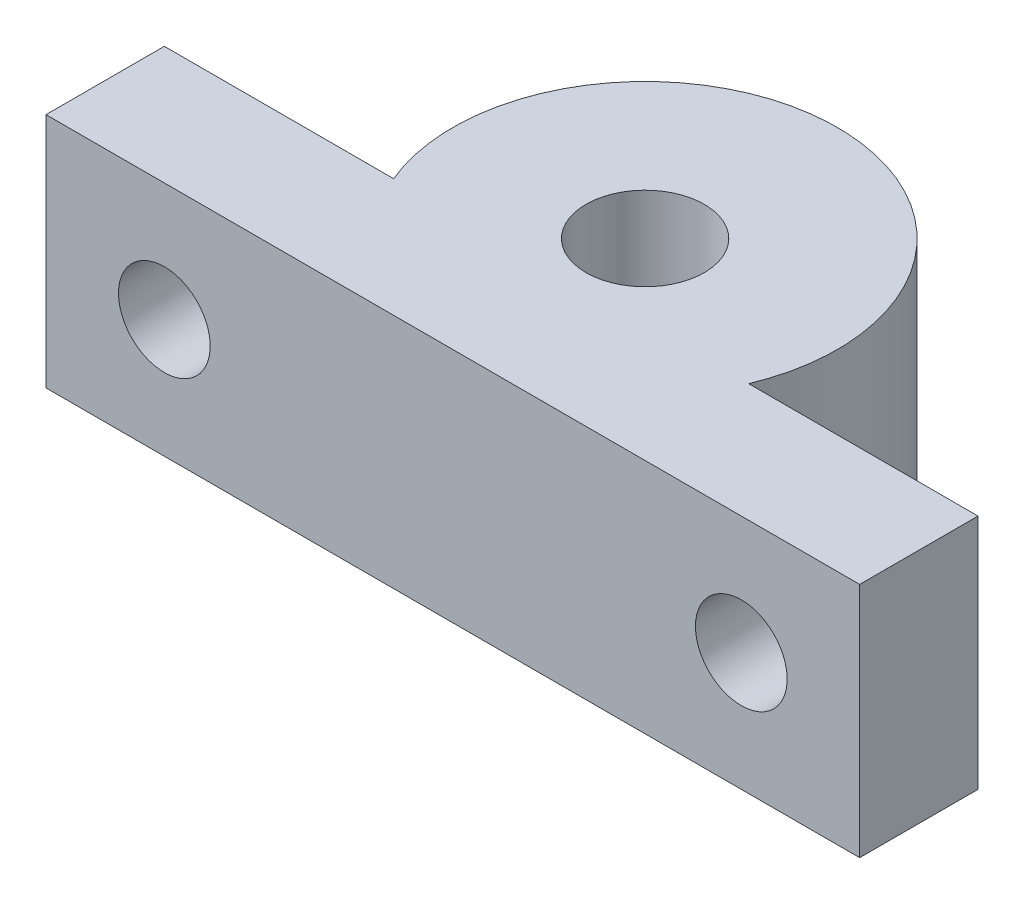
ISO-10303-21;
HEADER;
FILE_DESCRIPTION(('STEP AP214'),'2;1');
FILE_NAME('part.step','',(''),(''),'','','');
FILE_SCHEMA(('AUTOMOTIVE_DESIGN { 1 0 10303 214 1 1 1 1 }'));
ENDSEC;
DATA;
#1=APPLICATION_CONTEXT('core data for automotive mechanical design processes');
#2=APPLICATION_PROTOCOL_DEFINITION('international standard','automotive_design',2000,#1);
#3=PRODUCT_CONTEXT('',#1,'mechanical');
#4=PRODUCT('Part','Part','',(#3));
#5=PRODUCT_RELATED_PRODUCT_CATEGORY('part','',(#4));
#6=PRODUCT_DEFINITION_FORMATION('','',#4);
#7=PRODUCT_DEFINITION_CONTEXT('part definition',#1,'design');
#8=PRODUCT_DEFINITION('design','',#6,#7);
#9=PRODUCT_DEFINITION_SHAPE('','',#8);
#10=(LENGTH_UNIT() NAMED_UNIT(*) SI_UNIT(.MILLI.,.METRE.));
#11=(NAMED_UNIT(*) PLANE_ANGLE_UNIT() SI_UNIT($,.RADIAN.));
#12=(NAMED_UNIT(*) SI_UNIT($,.STERADIAN.) SOLID_ANGLE_UNIT());
#13=UNCERTAINTY_MEASURE_WITH_UNIT(LENGTH_MEASURE(1.E-05),#10,'distance_accuracy_value','');
#14=(GEOMETRIC_REPRESENTATION_CONTEXT(3) GLOBAL_UNCERTAINTY_ASSIGNED_CONTEXT((#13)) GLOBAL_UNIT_ASSIGNED_CONTEXT((#10,
#11,#12)) REPRESENTATION_CONTEXT('',''));
#15=CARTESIAN_POINT('',(0.,0.,0.));
#16=DIRECTION('',(0.,0.,1.));
#17=DIRECTION('',(1.,0.,0.));
#18=AXIS2_PLACEMENT_3D('',#15,#16,#17);
#19=CARTESIAN_POINT('',(0.,8.,0.));
#20=DIRECTION('',(0.,-1.,0.));
#21=DIRECTION('',(0.,0.,-1.));
#22=AXIS2_PLACEMENT_3D('',#19,#20,#21);
#23=CYLINDRICAL_SURFACE('',#22,6.5);
#24=CARTESIAN_POINT('',(0.,8.,0.));
#25=DIRECTION('',(0.,1.,0.));
#26=DIRECTION('',(0.,0.,1.));
#27=AXIS2_PLACEMENT_3D('',#24,#25,#26);
#28=CIRCLE('',#27,6.5);
#29=CARTESIAN_POINT('',(6.,8.,2.5));
#30=VERTEX_POINT('',#29);
#31=CARTESIAN_POINT('',(-6.,8.,2.5));
#32=VERTEX_POINT('',#31);
#33=EDGE_CURVE('E11',#30,#32,#28,.T.);
#34=ORIENTED_EDGE('',*,*,#33,.F.);
#35=DIRECTION('',(0.,-1.,0.));
#36=VECTOR('',#35,1.);
#37=CARTESIAN_POINT('',(6.,8.,2.5));
#38=LINE('',#37,#36);
#39=CARTESIAN_POINT('',(6.,0.,2.5));
#40=VERTEX_POINT('',#39);
#41=EDGE_CURVE('E156',#30,#40,#38,.T.);
#42=ORIENTED_EDGE('',*,*,#41,.T.);
#43=CARTESIAN_POINT('',(0.,0.,0.));
#44=DIRECTION('',(0.,1.,0.));
#45=DIRECTION('',(0.,0.,1.));
#46=AXIS2_PLACEMENT_3D('',#43,#44,#45);
#47=CIRCLE('',#46,6.5);
#48=CARTESIAN_POINT('',(-6.,0.,2.5));
#49=VERTEX_POINT('',#48);
#50=EDGE_CURVE('E46',#40,#49,#47,.T.);
#51=ORIENTED_EDGE('',*,*,#50,.T.);
#52=DIRECTION('',(0.,-1.,0.));
#53=VECTOR('',#52,1.);
#54=CARTESIAN_POINT('',(-6.,8.,2.5));
#55=LINE('',#54,#53);
#56=EDGE_CURVE('E114',#49,#32,#55,.F.);
#57=ORIENTED_EDGE('',*,*,#56,.T.);
#58=EDGE_LOOP('',(#34,#42,#51,#57));
#59=FACE_BOUND('',#58,.T.);
#60=ADVANCED_FACE('F43',(#59),#23,.T.);
#61=CARTESIAN_POINT('',(0.,8.,0.));
#62=DIRECTION('',(0.,1.,0.));
#63=DIRECTION('',(0.,0.,1.));
#64=AXIS2_PLACEMENT_3D('',#61,#62,#63);
#65=PLANE('',#64);
#66=CARTESIAN_POINT('',(0.,8.,0.));
#67=DIRECTION('',(0.,1.,0.));
#68=DIRECTION('',(0.,0.,1.));
#69=AXIS2_PLACEMENT_3D('',#66,#67,#68);
#70=CIRCLE('',#69,2.);
#71=CARTESIAN_POINT('',(0.,8.,2.));
#72=VERTEX_POINT('',#71);
#73=EDGE_CURVE('E231',#72,#72,#70,.T.);
#74=ORIENTED_EDGE('',*,*,#73,.F.);
#75=EDGE_LOOP('',(#74));
#76=FACE_BOUND('',#75,.T.);
#77=ORIENTED_EDGE('',*,*,#33,.T.);
#78=DIRECTION('',(-1.,0.,0.));
#79=VECTOR('',#78,1.);
#80=CARTESIAN_POINT('',(-13.75,8.,2.5));
#81=LINE('',#80,#79);
#82=CARTESIAN_POINT('',(-13.75,8.,2.5));
#83=VERTEX_POINT('',#82);
#84=EDGE_CURVE('E58',#32,#83,#81,.T.);
#85=ORIENTED_EDGE('',*,*,#84,.T.);
#86=DIRECTION('',(0.,0.,1.));
#87=VECTOR('',#86,1.);
#88=CARTESIAN_POINT('',(-13.75,8.,2.5));
#89=LINE('',#88,#87);
#90=CARTESIAN_POINT('',(-13.75,8.,6.5));
#91=VERTEX_POINT('',#90);
#92=EDGE_CURVE('E121',#83,#91,#89,.T.);
#93=ORIENTED_EDGE('',*,*,#92,.T.);
#94=DIRECTION('',(-1.,0.,0.));
#95=VECTOR('',#94,1.);
#96=CARTESIAN_POINT('',(-13.75,8.,6.5));
#97=LINE('',#96,#95);
#98=CARTESIAN_POINT('',(13.75,8.,6.5));
#99=VERTEX_POINT('',#98);
#100=EDGE_CURVE('E123',#99,#91,#97,.T.);
#101=ORIENTED_EDGE('',*,*,#100,.F.);
#102=DIRECTION('',(0.,0.,1.));
#103=VECTOR('',#102,1.);
#104=CARTESIAN_POINT('',(13.75,8.,2.5));
#105=LINE('',#104,#103);
#106=CARTESIAN_POINT('',(13.75,8.,2.5));
#107=VERTEX_POINT('',#106);
#108=EDGE_CURVE('E149',#107,#99,#105,.T.);
#109=ORIENTED_EDGE('',*,*,#108,.F.);
#110=EDGE_CURVE('E110',#107,#30,#81,.T.);
#111=ORIENTED_EDGE('',*,*,#110,.T.);
#112=EDGE_LOOP('',(#77,#85,#93,#101,#109,#111));
#113=FACE_BOUND('',#112,.T.);
#114=ADVANCED_FACE('F168',(#76,#113),#65,.T.);
#115=CARTESIAN_POINT('',(0.,0.,0.));
#116=DIRECTION('',(0.,1.,0.));
#117=DIRECTION('',(0.,0.,1.));
#118=AXIS2_PLACEMENT_3D('',#115,#116,#117);
#119=PLANE('',#118);
#120=CARTESIAN_POINT('',(0.,0.,0.));
#121=DIRECTION('',(0.,1.,0.));
#122=DIRECTION('',(0.,0.,1.));
#123=AXIS2_PLACEMENT_3D('',#120,#121,#122);
#124=CIRCLE('',#123,2.);
#125=CARTESIAN_POINT('',(0.,0.,2.));
#126=VERTEX_POINT('',#125);
#127=EDGE_CURVE('E130',#126,#126,#124,.F.);
#128=ORIENTED_EDGE('',*,*,#127,.F.);
#129=EDGE_LOOP('',(#128));
#130=FACE_BOUND('',#129,.T.);
#131=ORIENTED_EDGE('',*,*,#50,.F.);
#132=DIRECTION('',(1.,0.,0.));
#133=VECTOR('',#132,1.);
#134=CARTESIAN_POINT('',(13.75,0.,2.5));
#135=LINE('',#134,#133);
#136=CARTESIAN_POINT('',(13.75,0.,2.5));
#137=VERTEX_POINT('',#136);
#138=EDGE_CURVE('E66',#40,#137,#135,.T.);
#139=ORIENTED_EDGE('',*,*,#138,.T.);
#140=DIRECTION('',(0.,0.,1.));
#141=VECTOR('',#140,1.);
#142=CARTESIAN_POINT('',(13.75,0.,2.5));
#143=LINE('',#142,#141);
#144=CARTESIAN_POINT('',(13.75,0.,6.5));
#145=VERTEX_POINT('',#144);
#146=EDGE_CURVE('E109',#137,#145,#143,.T.);
#147=ORIENTED_EDGE('',*,*,#146,.T.);
#148=DIRECTION('',(1.,0.,0.));
#149=VECTOR('',#148,1.);
#150=CARTESIAN_POINT('',(13.75,0.,6.5));
#151=LINE('',#150,#149);
#152=CARTESIAN_POINT('',(-13.75,0.,6.5));
#153=VERTEX_POINT('',#152);
#154=EDGE_CURVE('E103',#153,#145,#151,.T.);
#155=ORIENTED_EDGE('',*,*,#154,.F.);
#156=DIRECTION('',(0.,0.,1.));
#157=VECTOR('',#156,1.);
#158=CARTESIAN_POINT('',(-13.75,0.,2.5));
#159=LINE('',#158,#157);
#160=CARTESIAN_POINT('',(-13.75,0.,2.5));
#161=VERTEX_POINT('',#160);
#162=EDGE_CURVE('E96',#161,#153,#159,.T.);
#163=ORIENTED_EDGE('',*,*,#162,.F.);
#164=EDGE_CURVE('E100',#161,#49,#135,.T.);
#165=ORIENTED_EDGE('',*,*,#164,.T.);
#166=EDGE_LOOP('',(#131,#139,#147,#155,#163,#165));
#167=FACE_BOUND('',#166,.T.);
#168=ADVANCED_FACE('F99',(#130,#167),#119,.F.);
#169=CARTESIAN_POINT('',(0.,0.,2.5));
#170=DIRECTION('',(0.,0.,-1.));
#171=DIRECTION('',(-1.,0.,0.));
#172=AXIS2_PLACEMENT_3D('',#169,#170,#171);
#173=PLANE('',#172);
#174=CARTESIAN_POINT('',(9.75,4.,2.5));
#175=DIRECTION('',(0.,0.,-1.));
#176=DIRECTION('',(-1.,0.,0.));
#177=AXIS2_PLACEMENT_3D('',#174,#175,#176);
#178=CIRCLE('',#177,1.55);
#179=CARTESIAN_POINT('',(8.2,4.,2.5));
#180=VERTEX_POINT('',#179);
#181=EDGE_CURVE('E220',#180,#180,#178,.T.);
#182=ORIENTED_EDGE('',*,*,#181,.F.);
#183=EDGE_LOOP('',(#182));
#184=FACE_BOUND('',#183,.T.);
#185=ORIENTED_EDGE('',*,*,#41,.F.);
#186=ORIENTED_EDGE('',*,*,#110,.F.);
#187=DIRECTION('',(0.,1.,0.));
#188=VECTOR('',#187,1.);
#189=CARTESIAN_POINT('',(13.75,8.,2.5));
#190=LINE('',#189,#188);
#191=EDGE_CURVE('E116',#137,#107,#190,.T.);
#192=ORIENTED_EDGE('',*,*,#191,.F.);
#193=ORIENTED_EDGE('',*,*,#138,.F.);
#194=EDGE_LOOP('',(#185,#186,#192,#193));
#195=FACE_BOUND('',#194,.T.);
#196=ADVANCED_FACE('F166',(#184,#195),#173,.T.);
#197=CARTESIAN_POINT('',(-9.75,4.,2.5));
#198=DIRECTION('',(0.,0.,-1.));
#199=DIRECTION('',(-1.,0.,0.));
#200=AXIS2_PLACEMENT_3D('',#197,#198,#199);
#201=CIRCLE('',#200,1.55);
#202=CARTESIAN_POINT('',(-11.3,4.,2.5));
#203=VERTEX_POINT('',#202);
#204=EDGE_CURVE('E226',#203,#203,#201,.T.);
#205=ORIENTED_EDGE('',*,*,#204,.F.);
#206=EDGE_LOOP('',(#205));
#207=FACE_BOUND('',#206,.T.);
#208=ORIENTED_EDGE('',*,*,#56,.F.);
#209=ORIENTED_EDGE('',*,*,#164,.F.);
#210=DIRECTION('',(0.,-1.,0.));
#211=VECTOR('',#210,1.);
#212=CARTESIAN_POINT('',(-13.75,0.,2.5));
#213=LINE('',#212,#211);
#214=EDGE_CURVE('E113',#83,#161,#213,.T.);
#215=ORIENTED_EDGE('',*,*,#214,.F.);
#216=ORIENTED_EDGE('',*,*,#84,.F.);
#217=EDGE_LOOP('',(#208,#209,#215,#216));
#218=FACE_BOUND('',#217,.T.);
#219=ADVANCED_FACE('F112',(#207,#218),#173,.T.);
#220=CARTESIAN_POINT('',(0.,0.,6.5));
#221=DIRECTION('',(0.,0.,-1.));
#222=DIRECTION('',(-1.,0.,0.));
#223=AXIS2_PLACEMENT_3D('',#220,#221,#222);
#224=PLANE('',#223);
#225=CARTESIAN_POINT('',(-9.75,4.,6.5));
#226=DIRECTION('',(0.,0.,-1.));
#227=DIRECTION('',(-1.,0.,0.));
#228=AXIS2_PLACEMENT_3D('',#225,#226,#227);
#229=CIRCLE('',#228,1.55);
#230=CARTESIAN_POINT('',(-11.3,4.,6.5));
#231=VERTEX_POINT('',#230);
#232=EDGE_CURVE('E229',#231,#231,#229,.F.);
#233=ORIENTED_EDGE('',*,*,#232,.F.);
#234=EDGE_LOOP('',(#233));
#235=FACE_BOUND('',#234,.T.);
#236=CARTESIAN_POINT('',(9.75,4.,6.5));
#237=DIRECTION('',(0.,0.,-1.));
#238=DIRECTION('',(-1.,0.,0.));
#239=AXIS2_PLACEMENT_3D('',#236,#237,#238);
#240=CIRCLE('',#239,1.55);
#241=CARTESIAN_POINT('',(8.2,4.,6.5));
#242=VERTEX_POINT('',#241);
#243=EDGE_CURVE('E222',#242,#242,#240,.F.);
#244=ORIENTED_EDGE('',*,*,#243,.F.);
#245=EDGE_LOOP('',(#244));
#246=FACE_BOUND('',#245,.T.);
#247=ORIENTED_EDGE('',*,*,#100,.T.);
#248=DIRECTION('',(0.,-1.,0.));
#249=VECTOR('',#248,1.);
#250=CARTESIAN_POINT('',(-13.75,0.,6.5));
#251=LINE('',#250,#249);
#252=EDGE_CURVE('E139',#91,#153,#251,.T.);
#253=ORIENTED_EDGE('',*,*,#252,.T.);
#254=ORIENTED_EDGE('',*,*,#154,.T.);
#255=DIRECTION('',(0.,1.,0.));
#256=VECTOR('',#255,1.);
#257=CARTESIAN_POINT('',(13.75,8.,6.5));
#258=LINE('',#257,#256);
#259=EDGE_CURVE('E127',#145,#99,#258,.T.);
#260=ORIENTED_EDGE('',*,*,#259,.T.);
#261=EDGE_LOOP('',(#247,#253,#254,#260));
#262=FACE_BOUND('',#261,.T.);
#263=ADVANCED_FACE('F171',(#235,#246,#262),#224,.F.);
#264=CARTESIAN_POINT('',(-13.75,0.,2.5));
#265=DIRECTION('',(-1.,0.,0.));
#266=DIRECTION('',(0.,0.,1.));
#267=AXIS2_PLACEMENT_3D('',#264,#265,#266);
#268=PLANE('',#267);
#269=ORIENTED_EDGE('',*,*,#252,.F.);
#270=ORIENTED_EDGE('',*,*,#92,.F.);
#271=ORIENTED_EDGE('',*,*,#214,.T.);
#272=ORIENTED_EDGE('',*,*,#162,.T.);
#273=EDGE_LOOP('',(#269,#270,#271,#272));
#274=FACE_BOUND('',#273,.T.);
#275=ADVANCED_FACE('F119',(#274),#268,.T.);
#276=CARTESIAN_POINT('',(13.75,8.,2.5));
#277=DIRECTION('',(1.,0.,0.));
#278=DIRECTION('',(0.,1.,0.));
#279=AXIS2_PLACEMENT_3D('',#276,#277,#278);
#280=PLANE('',#279);
#281=ORIENTED_EDGE('',*,*,#259,.F.);
#282=ORIENTED_EDGE('',*,*,#146,.F.);
#283=ORIENTED_EDGE('',*,*,#191,.T.);
#284=ORIENTED_EDGE('',*,*,#108,.T.);
#285=EDGE_LOOP('',(#281,#282,#283,#284));
#286=FACE_BOUND('',#285,.T.);
#287=ADVANCED_FACE('F164',(#286),#280,.T.);
#288=CARTESIAN_POINT('',(0.,-0.00100000000000273,0.));
#289=DIRECTION('',(0.,1.,0.));
#290=DIRECTION('',(0.,0.,1.));
#291=AXIS2_PLACEMENT_3D('',#288,#289,#290);
#292=CYLINDRICAL_SURFACE('',#291,2.);
#293=ORIENTED_EDGE('',*,*,#73,.T.);
#294=EDGE_LOOP('',(#293));
#295=FACE_BOUND('',#294,.T.);
#296=ORIENTED_EDGE('',*,*,#127,.T.);
#297=EDGE_LOOP('',(#296));
#298=FACE_BOUND('',#297,.T.);
#299=ADVANCED_FACE('F198',(#295,#298),#292,.F.);
#300=CARTESIAN_POINT('',(9.75,4.,6.501));
#301=DIRECTION('',(0.,0.,-1.));
#302=DIRECTION('',(-1.,0.,0.));
#303=AXIS2_PLACEMENT_3D('',#300,#301,#302);
#304=CYLINDRICAL_SURFACE('',#303,1.55);
#305=ORIENTED_EDGE('',*,*,#181,.T.);
#306=EDGE_LOOP('',(#305));
#307=FACE_BOUND('',#306,.T.);
#308=ORIENTED_EDGE('',*,*,#243,.T.);
#309=EDGE_LOOP('',(#308));
#310=FACE_BOUND('',#309,.T.);
#311=ADVANCED_FACE('F202',(#307,#310),#304,.F.);
#312=CARTESIAN_POINT('',(-9.75,4.,6.501));
#313=DIRECTION('',(0.,0.,-1.));
#314=DIRECTION('',(-1.,0.,0.));
#315=AXIS2_PLACEMENT_3D('',#312,#313,#314);
#316=CYLINDRICAL_SURFACE('',#315,1.55);
#317=ORIENTED_EDGE('',*,*,#204,.T.);
#318=EDGE_LOOP('',(#317));
#319=FACE_BOUND('',#318,.T.);
#320=ORIENTED_EDGE('',*,*,#232,.T.);
#321=EDGE_LOOP('',(#320));
#322=FACE_BOUND('',#321,.T.);
#323=ADVANCED_FACE('F208',(#319,#322),#316,.F.);
#324=CLOSED_SHELL('',(#60,#114,#168,#196,#219,#263,#275,#287,#299,#311,#323));
#325=MANIFOLD_SOLID_BREP('B2',#324);
#326=ADVANCED_BREP_SHAPE_REPRESENTATION('',(#18,#325),#14);
#327=SHAPE_DEFINITION_REPRESENTATION(#9,#326);
ENDSEC;
END-ISO-10303-21;
